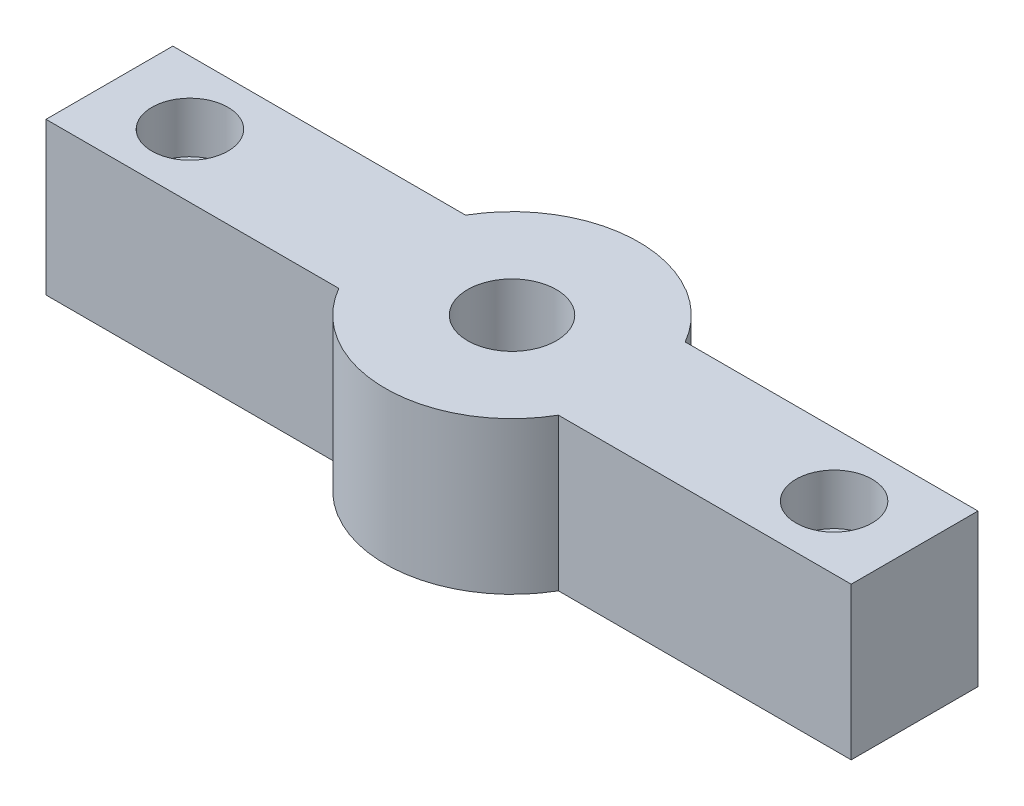
ISO-10303-21;
HEADER;
FILE_DESCRIPTION(('STEP AP214'),'2;1');
FILE_NAME('part.step','',(''),(''),'','','');
FILE_SCHEMA(('AUTOMOTIVE_DESIGN { 1 0 10303 214 1 1 1 1 }'));
ENDSEC;
DATA;
#1=APPLICATION_CONTEXT('core data for automotive mechanical design processes');
#2=APPLICATION_PROTOCOL_DEFINITION('international standard','automotive_design',2000,#1);
#3=PRODUCT_CONTEXT('',#1,'mechanical');
#4=PRODUCT('Part','Part','',(#3));
#5=PRODUCT_RELATED_PRODUCT_CATEGORY('part','',(#4));
#6=PRODUCT_DEFINITION_FORMATION('','',#4);
#7=PRODUCT_DEFINITION_CONTEXT('part definition',#1,'design');
#8=PRODUCT_DEFINITION('design','',#6,#7);
#9=PRODUCT_DEFINITION_SHAPE('','',#8);
#10=(LENGTH_UNIT() NAMED_UNIT(*) SI_UNIT(.MILLI.,.METRE.));
#11=(NAMED_UNIT(*) PLANE_ANGLE_UNIT() SI_UNIT($,.RADIAN.));
#12=(NAMED_UNIT(*) SI_UNIT($,.STERADIAN.) SOLID_ANGLE_UNIT());
#13=UNCERTAINTY_MEASURE_WITH_UNIT(LENGTH_MEASURE(1.E-05),#10,'distance_accuracy_value','');
#14=(GEOMETRIC_REPRESENTATION_CONTEXT(3) GLOBAL_UNCERTAINTY_ASSIGNED_CONTEXT((#13)) GLOBAL_UNIT_ASSIGNED_CONTEXT((#10,
#11,#12)) REPRESENTATION_CONTEXT('',''));
#15=CARTESIAN_POINT('',(0.,0.,0.));
#16=DIRECTION('',(0.,0.,1.));
#17=DIRECTION('',(1.,0.,0.));
#18=AXIS2_PLACEMENT_3D('',#15,#16,#17);
#19=CARTESIAN_POINT('',(12.7,6.,0.));
#20=DIRECTION('',(0.,-1.,0.));
#21=DIRECTION('',(0.,0.,-1.));
#22=AXIS2_PLACEMENT_3D('',#19,#20,#21);
#23=CYLINDRICAL_SURFACE('',#22,0.889000000000002);
#24=CARTESIAN_POINT('',(12.7,0.,0.));
#25=DIRECTION('',(0.,1.,0.));
#26=DIRECTION('',(0.,0.,-1.));
#27=AXIS2_PLACEMENT_3D('',#24,#25,#26);
#28=CIRCLE('',#27,0.889000000000002);
#29=CARTESIAN_POINT('',(12.7,0.,-0.889000000000002));
#30=VERTEX_POINT('',#29);
#31=EDGE_CURVE('E161',#30,#30,#28,.T.);
#32=ORIENTED_EDGE('',*,*,#31,.F.);
#33=EDGE_LOOP('',(#32));
#34=FACE_BOUND('',#33,.T.);
#35=CARTESIAN_POINT('',(12.7,4.,0.));
#36=DIRECTION('',(0.,1.,0.));
#37=DIRECTION('',(0.,0.,1.));
#38=AXIS2_PLACEMENT_3D('',#35,#36,#37);
#39=CIRCLE('',#38,0.889000000000002);
#40=CARTESIAN_POINT('',(12.7,4.,0.889000000000002));
#41=VERTEX_POINT('',#40);
#42=EDGE_CURVE('E37',#41,#41,#39,.T.);
#43=ORIENTED_EDGE('',*,*,#42,.T.);
#44=EDGE_LOOP('',(#43));
#45=FACE_BOUND('',#44,.T.);
#46=ADVANCED_FACE('F33',(#34,#45),#23,.F.);
#47=CARTESIAN_POINT('',(-12.7,6.,0.));
#48=DIRECTION('',(0.,-1.,0.));
#49=DIRECTION('',(0.,0.,-1.));
#50=AXIS2_PLACEMENT_3D('',#47,#48,#49);
#51=CYLINDRICAL_SURFACE('',#50,0.889000000000002);
#52=CARTESIAN_POINT('',(-12.7,0.,0.));
#53=DIRECTION('',(0.,1.,0.));
#54=DIRECTION('',(0.,0.,1.));
#55=AXIS2_PLACEMENT_3D('',#52,#53,#54);
#56=CIRCLE('',#55,0.889000000000002);
#57=CARTESIAN_POINT('',(-12.7,0.,0.889000000000002));
#58=VERTEX_POINT('',#57);
#59=EDGE_CURVE('E166',#58,#58,#56,.T.);
#60=ORIENTED_EDGE('',*,*,#59,.F.);
#61=EDGE_LOOP('',(#60));
#62=FACE_BOUND('',#61,.T.);
#63=CARTESIAN_POINT('',(-12.7,4.,0.));
#64=DIRECTION('',(0.,1.,0.));
#65=DIRECTION('',(0.,0.,1.));
#66=AXIS2_PLACEMENT_3D('',#63,#64,#65);
#67=CIRCLE('',#66,0.889000000000002);
#68=CARTESIAN_POINT('',(-12.7,4.,0.889000000000002));
#69=VERTEX_POINT('',#68);
#70=EDGE_CURVE('E159',#69,#69,#67,.T.);
#71=ORIENTED_EDGE('',*,*,#70,.T.);
#72=EDGE_LOOP('',(#71));
#73=FACE_BOUND('',#72,.T.);
#74=ADVANCED_FACE('F223',(#62,#73),#51,.F.);
#75=CARTESIAN_POINT('',(0.,6.,0.));
#76=DIRECTION('',(0.,1.,0.));
#77=DIRECTION('',(0.,0.,1.));
#78=AXIS2_PLACEMENT_3D('',#75,#76,#77);
#79=PLANE('',#78);
#80=CARTESIAN_POINT('',(12.7,6.,0.));
#81=DIRECTION('',(0.,1.,0.));
#82=DIRECTION('',(0.,0.,1.));
#83=AXIS2_PLACEMENT_3D('',#80,#81,#82);
#84=CIRCLE('',#83,1.5);
#85=CARTESIAN_POINT('',(12.7,6.,1.5));
#86=VERTEX_POINT('',#85);
#87=EDGE_CURVE('E176',#86,#86,#84,.T.);
#88=ORIENTED_EDGE('',*,*,#87,.F.);
#89=EDGE_LOOP('',(#88));
#90=FACE_BOUND('',#89,.T.);
#91=CARTESIAN_POINT('',(-12.7,6.,0.));
#92=DIRECTION('',(0.,1.,0.));
#93=DIRECTION('',(0.,0.,1.));
#94=AXIS2_PLACEMENT_3D('',#91,#92,#93);
#95=CIRCLE('',#94,1.5);
#96=CARTESIAN_POINT('',(-12.7,6.,1.5));
#97=VERTEX_POINT('',#96);
#98=EDGE_CURVE('E169',#97,#97,#95,.T.);
#99=ORIENTED_EDGE('',*,*,#98,.F.);
#100=EDGE_LOOP('',(#99));
#101=FACE_BOUND('',#100,.T.);
#102=DIRECTION('',(-1.,0.,0.));
#103=VECTOR('',#102,1.);
#104=CARTESIAN_POINT('',(-4.33012701892219,6.,-2.5));
#105=LINE('',#104,#103);
#106=CARTESIAN_POINT('',(-4.33012701892219,6.,-2.5));
#107=VERTEX_POINT('',#106);
#108=CARTESIAN_POINT('',(-15.875,6.,-2.5));
#109=VERTEX_POINT('',#108);
#110=EDGE_CURVE('E148',#107,#109,#105,.T.);
#111=ORIENTED_EDGE('',*,*,#110,.T.);
#112=DIRECTION('',(0.,0.,1.));
#113=VECTOR('',#112,1.);
#114=CARTESIAN_POINT('',(-15.875,6.,-2.5));
#115=LINE('',#114,#113);
#116=CARTESIAN_POINT('',(-15.875,6.,2.5));
#117=VERTEX_POINT('',#116);
#118=EDGE_CURVE('E95',#109,#117,#115,.T.);
#119=ORIENTED_EDGE('',*,*,#118,.T.);
#120=DIRECTION('',(1.,0.,0.));
#121=VECTOR('',#120,1.);
#122=CARTESIAN_POINT('',(-15.875,6.,2.5));
#123=LINE('',#122,#121);
#124=CARTESIAN_POINT('',(-4.33012701892219,6.,2.5));
#125=VERTEX_POINT('',#124);
#126=EDGE_CURVE('E188',#117,#125,#123,.T.);
#127=ORIENTED_EDGE('',*,*,#126,.T.);
#128=CARTESIAN_POINT('',(0.,6.,0.));
#129=DIRECTION('',(0.,1.,0.));
#130=DIRECTION('',(0.,0.,1.));
#131=AXIS2_PLACEMENT_3D('',#128,#129,#130);
#132=CIRCLE('',#131,5.);
#133=CARTESIAN_POINT('',(4.33012701892219,6.,2.5));
#134=VERTEX_POINT('',#133);
#135=EDGE_CURVE('E190',#125,#134,#132,.T.);
#136=ORIENTED_EDGE('',*,*,#135,.T.);
#137=DIRECTION('',(1.,0.,0.));
#138=VECTOR('',#137,1.);
#139=CARTESIAN_POINT('',(4.33012701892219,6.,2.5));
#140=LINE('',#139,#138);
#141=CARTESIAN_POINT('',(15.875,6.,2.5));
#142=VERTEX_POINT('',#141);
#143=EDGE_CURVE('E115',#134,#142,#140,.T.);
#144=ORIENTED_EDGE('',*,*,#143,.T.);
#145=DIRECTION('',(0.,0.,-1.));
#146=VECTOR('',#145,1.);
#147=CARTESIAN_POINT('',(15.875,6.,2.5));
#148=LINE('',#147,#146);
#149=CARTESIAN_POINT('',(15.875,6.,-2.5));
#150=VERTEX_POINT('',#149);
#151=EDGE_CURVE('E108',#142,#150,#148,.T.);
#152=ORIENTED_EDGE('',*,*,#151,.T.);
#153=DIRECTION('',(-1.,0.,0.));
#154=VECTOR('',#153,1.);
#155=CARTESIAN_POINT('',(15.875,6.,-2.5));
#156=LINE('',#155,#154);
#157=CARTESIAN_POINT('',(4.33012701892219,6.,-2.5));
#158=VERTEX_POINT('',#157);
#159=EDGE_CURVE('E113',#150,#158,#156,.T.);
#160=ORIENTED_EDGE('',*,*,#159,.T.);
#161=CARTESIAN_POINT('',(0.,6.,0.));
#162=DIRECTION('',(0.,1.,0.));
#163=DIRECTION('',(0.,0.,1.));
#164=AXIS2_PLACEMENT_3D('',#161,#162,#163);
#165=CIRCLE('',#164,5.);
#166=EDGE_CURVE('E52',#158,#107,#165,.T.);
#167=ORIENTED_EDGE('',*,*,#166,.T.);
#168=EDGE_LOOP('',(#111,#119,#127,#136,#144,#152,#160,#167));
#169=FACE_BOUND('',#168,.T.);
#170=CARTESIAN_POINT('',(0.,6.,0.));
#171=DIRECTION('',(0.,1.,0.));
#172=DIRECTION('',(0.,0.,1.));
#173=AXIS2_PLACEMENT_3D('',#170,#171,#172);
#174=CIRCLE('',#173,1.75);
#175=CARTESIAN_POINT('',(0.,6.,1.75));
#176=VERTEX_POINT('',#175);
#177=EDGE_CURVE('E137',#176,#176,#174,.T.);
#178=ORIENTED_EDGE('',*,*,#177,.F.);
#179=EDGE_LOOP('',(#178));
#180=FACE_BOUND('',#179,.T.);
#181=ADVANCED_FACE('F110',(#90,#101,#169,#180),#79,.T.);
#182=CARTESIAN_POINT('',(0.,0.,0.));
#183=DIRECTION('',(0.,1.,0.));
#184=DIRECTION('',(0.,0.,1.));
#185=AXIS2_PLACEMENT_3D('',#182,#183,#184);
#186=PLANE('',#185);
#187=ORIENTED_EDGE('',*,*,#59,.T.);
#188=EDGE_LOOP('',(#187));
#189=FACE_BOUND('',#188,.T.);
#190=DIRECTION('',(-1.,0.,0.));
#191=VECTOR('',#190,1.);
#192=CARTESIAN_POINT('',(-4.33012701892219,0.,-2.5));
#193=LINE('',#192,#191);
#194=CARTESIAN_POINT('',(-4.33012701892219,0.,-2.5));
#195=VERTEX_POINT('',#194);
#196=CARTESIAN_POINT('',(-15.875,0.,-2.5));
#197=VERTEX_POINT('',#196);
#198=EDGE_CURVE('E133',#195,#197,#193,.T.);
#199=ORIENTED_EDGE('',*,*,#198,.F.);
#200=CARTESIAN_POINT('',(0.,0.,0.));
#201=DIRECTION('',(0.,1.,0.));
#202=DIRECTION('',(0.,0.,1.));
#203=AXIS2_PLACEMENT_3D('',#200,#201,#202);
#204=CIRCLE('',#203,5.);
#205=CARTESIAN_POINT('',(4.33012701892219,0.,-2.5));
#206=VERTEX_POINT('',#205);
#207=EDGE_CURVE('E87',#206,#195,#204,.T.);
#208=ORIENTED_EDGE('',*,*,#207,.F.);
#209=DIRECTION('',(-1.,0.,0.));
#210=VECTOR('',#209,1.);
#211=CARTESIAN_POINT('',(15.875,0.,-2.5));
#212=LINE('',#211,#210);
#213=CARTESIAN_POINT('',(15.875,0.,-2.5));
#214=VERTEX_POINT('',#213);
#215=EDGE_CURVE('E81',#214,#206,#212,.T.);
#216=ORIENTED_EDGE('',*,*,#215,.F.);
#217=DIRECTION('',(0.,0.,-1.));
#218=VECTOR('',#217,1.);
#219=CARTESIAN_POINT('',(15.875,0.,2.5));
#220=LINE('',#219,#218);
#221=CARTESIAN_POINT('',(15.875,0.,2.5));
#222=VERTEX_POINT('',#221);
#223=EDGE_CURVE('E123',#222,#214,#220,.T.);
#224=ORIENTED_EDGE('',*,*,#223,.F.);
#225=DIRECTION('',(1.,0.,0.));
#226=VECTOR('',#225,1.);
#227=CARTESIAN_POINT('',(4.33012701892219,0.,2.5));
#228=LINE('',#227,#226);
#229=CARTESIAN_POINT('',(4.33012701892219,0.,2.5));
#230=VERTEX_POINT('',#229);
#231=EDGE_CURVE('E143',#230,#222,#228,.T.);
#232=ORIENTED_EDGE('',*,*,#231,.F.);
#233=CARTESIAN_POINT('',(0.,0.,0.));
#234=DIRECTION('',(0.,1.,0.));
#235=DIRECTION('',(0.,0.,1.));
#236=AXIS2_PLACEMENT_3D('',#233,#234,#235);
#237=CIRCLE('',#236,5.);
#238=CARTESIAN_POINT('',(-4.33012701892219,0.,2.5));
#239=VERTEX_POINT('',#238);
#240=EDGE_CURVE('E141',#239,#230,#237,.T.);
#241=ORIENTED_EDGE('',*,*,#240,.F.);
#242=DIRECTION('',(1.,0.,0.));
#243=VECTOR('',#242,1.);
#244=CARTESIAN_POINT('',(-15.875,0.,2.5));
#245=LINE('',#244,#243);
#246=CARTESIAN_POINT('',(-15.875,0.,2.5));
#247=VERTEX_POINT('',#246);
#248=EDGE_CURVE('E139',#247,#239,#245,.T.);
#249=ORIENTED_EDGE('',*,*,#248,.F.);
#250=DIRECTION('',(0.,0.,1.));
#251=VECTOR('',#250,1.);
#252=CARTESIAN_POINT('',(-15.875,0.,-2.5));
#253=LINE('',#252,#251);
#254=EDGE_CURVE('E136',#197,#247,#253,.T.);
#255=ORIENTED_EDGE('',*,*,#254,.F.);
#256=EDGE_LOOP('',(#199,#208,#216,#224,#232,#241,#249,#255));
#257=FACE_BOUND('',#256,.T.);
#258=CARTESIAN_POINT('',(0.,0.,0.));
#259=DIRECTION('',(0.,1.,0.));
#260=DIRECTION('',(0.,0.,1.));
#261=AXIS2_PLACEMENT_3D('',#258,#259,#260);
#262=CIRCLE('',#261,1.75);
#263=CARTESIAN_POINT('',(0.,0.,1.75));
#264=VERTEX_POINT('',#263);
#265=EDGE_CURVE('E181',#264,#264,#262,.T.);
#266=ORIENTED_EDGE('',*,*,#265,.T.);
#267=EDGE_LOOP('',(#266));
#268=FACE_BOUND('',#267,.T.);
#269=ORIENTED_EDGE('',*,*,#31,.T.);
#270=EDGE_LOOP('',(#269));
#271=FACE_BOUND('',#270,.T.);
#272=ADVANCED_FACE('F203',(#189,#257,#268,#271),#186,.F.);
#273=CARTESIAN_POINT('',(-4.33012701892219,6.,-2.5));
#274=DIRECTION('',(0.,0.,1.));
#275=DIRECTION('',(1.,0.,0.));
#276=AXIS2_PLACEMENT_3D('',#273,#274,#275);
#277=PLANE('',#276);
#278=ORIENTED_EDGE('',*,*,#198,.T.);
#279=DIRECTION('',(0.,-1.,0.));
#280=VECTOR('',#279,1.);
#281=CARTESIAN_POINT('',(-15.875,6.,-2.5));
#282=LINE('',#281,#280);
#283=EDGE_CURVE('E11',#109,#197,#282,.T.);
#284=ORIENTED_EDGE('',*,*,#283,.F.);
#285=ORIENTED_EDGE('',*,*,#110,.F.);
#286=DIRECTION('',(0.,-1.,0.));
#287=VECTOR('',#286,1.);
#288=CARTESIAN_POINT('',(-4.33012701892219,6.,-2.5));
#289=LINE('',#288,#287);
#290=EDGE_CURVE('E129',#107,#195,#289,.T.);
#291=ORIENTED_EDGE('',*,*,#290,.T.);
#292=EDGE_LOOP('',(#278,#284,#285,#291));
#293=FACE_BOUND('',#292,.T.);
#294=ADVANCED_FACE('F35',(#293),#277,.F.);
#295=CARTESIAN_POINT('',(-15.875,6.,-2.5));
#296=DIRECTION('',(1.,0.,0.));
#297=DIRECTION('',(0.,0.,-1.));
#298=AXIS2_PLACEMENT_3D('',#295,#296,#297);
#299=PLANE('',#298);
#300=ORIENTED_EDGE('',*,*,#254,.T.);
#301=DIRECTION('',(0.,-1.,0.));
#302=VECTOR('',#301,1.);
#303=CARTESIAN_POINT('',(-15.875,6.,2.5));
#304=LINE('',#303,#302);
#305=EDGE_CURVE('E43',#117,#247,#304,.T.);
#306=ORIENTED_EDGE('',*,*,#305,.F.);
#307=ORIENTED_EDGE('',*,*,#118,.F.);
#308=ORIENTED_EDGE('',*,*,#283,.T.);
#309=EDGE_LOOP('',(#300,#306,#307,#308));
#310=FACE_BOUND('',#309,.T.);
#311=ADVANCED_FACE('F243',(#310),#299,.F.);
#312=CARTESIAN_POINT('',(-15.875,6.,2.5));
#313=DIRECTION('',(0.,0.,-1.));
#314=DIRECTION('',(-1.,0.,0.));
#315=AXIS2_PLACEMENT_3D('',#312,#313,#314);
#316=PLANE('',#315);
#317=ORIENTED_EDGE('',*,*,#248,.T.);
#318=DIRECTION('',(0.,-1.,0.));
#319=VECTOR('',#318,1.);
#320=CARTESIAN_POINT('',(-4.33012701892219,6.,2.5));
#321=LINE('',#320,#319);
#322=EDGE_CURVE('E155',#125,#239,#321,.T.);
#323=ORIENTED_EDGE('',*,*,#322,.F.);
#324=ORIENTED_EDGE('',*,*,#126,.F.);
#325=ORIENTED_EDGE('',*,*,#305,.T.);
#326=EDGE_LOOP('',(#317,#323,#324,#325));
#327=FACE_BOUND('',#326,.T.);
#328=ADVANCED_FACE('F248',(#327),#316,.F.);
#329=CARTESIAN_POINT('',(0.,6.,0.));
#330=DIRECTION('',(0.,-1.,0.));
#331=DIRECTION('',(0.,0.,-1.));
#332=AXIS2_PLACEMENT_3D('',#329,#330,#331);
#333=CYLINDRICAL_SURFACE('',#332,5.);
#334=ORIENTED_EDGE('',*,*,#240,.T.);
#335=DIRECTION('',(0.,-1.,0.));
#336=VECTOR('',#335,1.);
#337=CARTESIAN_POINT('',(4.33012701892219,6.,2.5));
#338=LINE('',#337,#336);
#339=EDGE_CURVE('E152',#134,#230,#338,.T.);
#340=ORIENTED_EDGE('',*,*,#339,.F.);
#341=ORIENTED_EDGE('',*,*,#135,.F.);
#342=ORIENTED_EDGE('',*,*,#322,.T.);
#343=EDGE_LOOP('',(#334,#340,#341,#342));
#344=FACE_BOUND('',#343,.T.);
#345=ADVANCED_FACE('F196',(#344),#333,.T.);
#346=CARTESIAN_POINT('',(4.33012701892219,6.,2.5));
#347=DIRECTION('',(0.,0.,-1.));
#348=DIRECTION('',(-1.,0.,0.));
#349=AXIS2_PLACEMENT_3D('',#346,#347,#348);
#350=PLANE('',#349);
#351=ORIENTED_EDGE('',*,*,#231,.T.);
#352=DIRECTION('',(0.,-1.,0.));
#353=VECTOR('',#352,1.);
#354=CARTESIAN_POINT('',(15.875,6.,2.5));
#355=LINE('',#354,#353);
#356=EDGE_CURVE('E124',#142,#222,#355,.T.);
#357=ORIENTED_EDGE('',*,*,#356,.F.);
#358=ORIENTED_EDGE('',*,*,#143,.F.);
#359=ORIENTED_EDGE('',*,*,#339,.T.);
#360=EDGE_LOOP('',(#351,#357,#358,#359));
#361=FACE_BOUND('',#360,.T.);
#362=ADVANCED_FACE('F200',(#361),#350,.F.);
#363=CARTESIAN_POINT('',(15.875,6.,2.5));
#364=DIRECTION('',(-1.,0.,0.));
#365=DIRECTION('',(0.,0.,1.));
#366=AXIS2_PLACEMENT_3D('',#363,#364,#365);
#367=PLANE('',#366);
#368=ORIENTED_EDGE('',*,*,#223,.T.);
#369=DIRECTION('',(0.,-1.,0.));
#370=VECTOR('',#369,1.);
#371=CARTESIAN_POINT('',(15.875,6.,-2.5));
#372=LINE('',#371,#370);
#373=EDGE_CURVE('E120',#150,#214,#372,.T.);
#374=ORIENTED_EDGE('',*,*,#373,.F.);
#375=ORIENTED_EDGE('',*,*,#151,.F.);
#376=ORIENTED_EDGE('',*,*,#356,.T.);
#377=EDGE_LOOP('',(#368,#374,#375,#376));
#378=FACE_BOUND('',#377,.T.);
#379=ADVANCED_FACE('F121',(#378),#367,.F.);
#380=CARTESIAN_POINT('',(15.875,6.,-2.5));
#381=DIRECTION('',(0.,0.,1.));
#382=DIRECTION('',(1.,0.,0.));
#383=AXIS2_PLACEMENT_3D('',#380,#381,#382);
#384=PLANE('',#383);
#385=ORIENTED_EDGE('',*,*,#215,.T.);
#386=DIRECTION('',(0.,-1.,0.));
#387=VECTOR('',#386,1.);
#388=CARTESIAN_POINT('',(4.33012701892219,6.,-2.5));
#389=LINE('',#388,#387);
#390=EDGE_CURVE('E125',#158,#206,#389,.T.);
#391=ORIENTED_EDGE('',*,*,#390,.F.);
#392=ORIENTED_EDGE('',*,*,#159,.F.);
#393=ORIENTED_EDGE('',*,*,#373,.T.);
#394=EDGE_LOOP('',(#385,#391,#392,#393));
#395=FACE_BOUND('',#394,.T.);
#396=ADVANCED_FACE('F127',(#395),#384,.F.);
#397=CARTESIAN_POINT('',(0.,6.,0.));
#398=DIRECTION('',(0.,-1.,0.));
#399=DIRECTION('',(0.,0.,-1.));
#400=AXIS2_PLACEMENT_3D('',#397,#398,#399);
#401=CYLINDRICAL_SURFACE('',#400,5.);
#402=ORIENTED_EDGE('',*,*,#207,.T.);
#403=ORIENTED_EDGE('',*,*,#290,.F.);
#404=ORIENTED_EDGE('',*,*,#166,.F.);
#405=ORIENTED_EDGE('',*,*,#390,.T.);
#406=EDGE_LOOP('',(#402,#403,#404,#405));
#407=FACE_BOUND('',#406,.T.);
#408=ADVANCED_FACE('F209',(#407),#401,.T.);
#409=CARTESIAN_POINT('',(0.,6.,0.));
#410=DIRECTION('',(0.,-1.,0.));
#411=DIRECTION('',(0.,0.,-1.));
#412=AXIS2_PLACEMENT_3D('',#409,#410,#411);
#413=CYLINDRICAL_SURFACE('',#412,1.75);
#414=ORIENTED_EDGE('',*,*,#177,.T.);
#415=EDGE_LOOP('',(#414));
#416=FACE_BOUND('',#415,.T.);
#417=ORIENTED_EDGE('',*,*,#265,.F.);
#418=EDGE_LOOP('',(#417));
#419=FACE_BOUND('',#418,.T.);
#420=ADVANCED_FACE('F211',(#416,#419),#413,.F.);
#421=CARTESIAN_POINT('',(-12.7,4.,0.));
#422=DIRECTION('',(0.,1.,0.));
#423=DIRECTION('',(0.,0.,1.));
#424=AXIS2_PLACEMENT_3D('',#421,#422,#423);
#425=CYLINDRICAL_SURFACE('',#424,1.5);
#426=CARTESIAN_POINT('',(-12.7,4.,0.));
#427=DIRECTION('',(0.,1.,0.));
#428=DIRECTION('',(0.,0.,1.));
#429=AXIS2_PLACEMENT_3D('',#426,#427,#428);
#430=CIRCLE('',#429,1.5);
#431=CARTESIAN_POINT('',(-12.7,4.,1.5));
#432=VERTEX_POINT('',#431);
#433=EDGE_CURVE('E162',#432,#432,#430,.T.);
#434=ORIENTED_EDGE('',*,*,#433,.F.);
#435=EDGE_LOOP('',(#434));
#436=FACE_BOUND('',#435,.T.);
#437=ORIENTED_EDGE('',*,*,#98,.T.);
#438=EDGE_LOOP('',(#437));
#439=FACE_BOUND('',#438,.T.);
#440=ADVANCED_FACE('F217',(#436,#439),#425,.F.);
#441=CARTESIAN_POINT('',(-12.7,4.,0.));
#442=DIRECTION('',(0.,1.,0.));
#443=DIRECTION('',(0.,0.,1.));
#444=AXIS2_PLACEMENT_3D('',#441,#442,#443);
#445=PLANE('',#444);
#446=ORIENTED_EDGE('',*,*,#70,.F.);
#447=EDGE_LOOP('',(#446));
#448=FACE_BOUND('',#447,.T.);
#449=ORIENTED_EDGE('',*,*,#433,.T.);
#450=EDGE_LOOP('',(#449));
#451=FACE_BOUND('',#450,.T.);
#452=ADVANCED_FACE('F304',(#448,#451),#445,.T.);
#453=CARTESIAN_POINT('',(12.7,4.,0.));
#454=DIRECTION('',(0.,1.,0.));
#455=DIRECTION('',(0.,0.,1.));
#456=AXIS2_PLACEMENT_3D('',#453,#454,#455);
#457=CYLINDRICAL_SURFACE('',#456,1.5);
#458=CARTESIAN_POINT('',(12.7,4.,0.));
#459=DIRECTION('',(0.,1.,0.));
#460=DIRECTION('',(0.,0.,1.));
#461=AXIS2_PLACEMENT_3D('',#458,#459,#460);
#462=CIRCLE('',#461,1.5);
#463=CARTESIAN_POINT('',(12.7,4.,1.5));
#464=VERTEX_POINT('',#463);
#465=EDGE_CURVE('E341',#464,#464,#462,.T.);
#466=ORIENTED_EDGE('',*,*,#465,.F.);
#467=EDGE_LOOP('',(#466));
#468=FACE_BOUND('',#467,.T.);
#469=ORIENTED_EDGE('',*,*,#87,.T.);
#470=EDGE_LOOP('',(#469));
#471=FACE_BOUND('',#470,.T.);
#472=ADVANCED_FACE('F313',(#468,#471),#457,.F.);
#473=CARTESIAN_POINT('',(12.7,4.,0.));
#474=DIRECTION('',(0.,1.,0.));
#475=DIRECTION('',(0.,0.,1.));
#476=AXIS2_PLACEMENT_3D('',#473,#474,#475);
#477=PLANE('',#476);
#478=ORIENTED_EDGE('',*,*,#42,.F.);
#479=EDGE_LOOP('',(#478));
#480=FACE_BOUND('',#479,.T.);
#481=ORIENTED_EDGE('',*,*,#465,.T.);
#482=EDGE_LOOP('',(#481));
#483=FACE_BOUND('',#482,.T.);
#484=ADVANCED_FACE('F322',(#480,#483),#477,.T.);
#485=CLOSED_SHELL('',(#46,#74,#181,#272,#294,#311,#328,#345,#362,#379,#396,#408,#420,#440,#452,
#472,#484));
#486=MANIFOLD_SOLID_BREP('B2',#485);
#487=ADVANCED_BREP_SHAPE_REPRESENTATION('',(#18,#486),#14);
#488=SHAPE_DEFINITION_REPRESENTATION(#9,#487);
ENDSEC;
END-ISO-10303-21;
